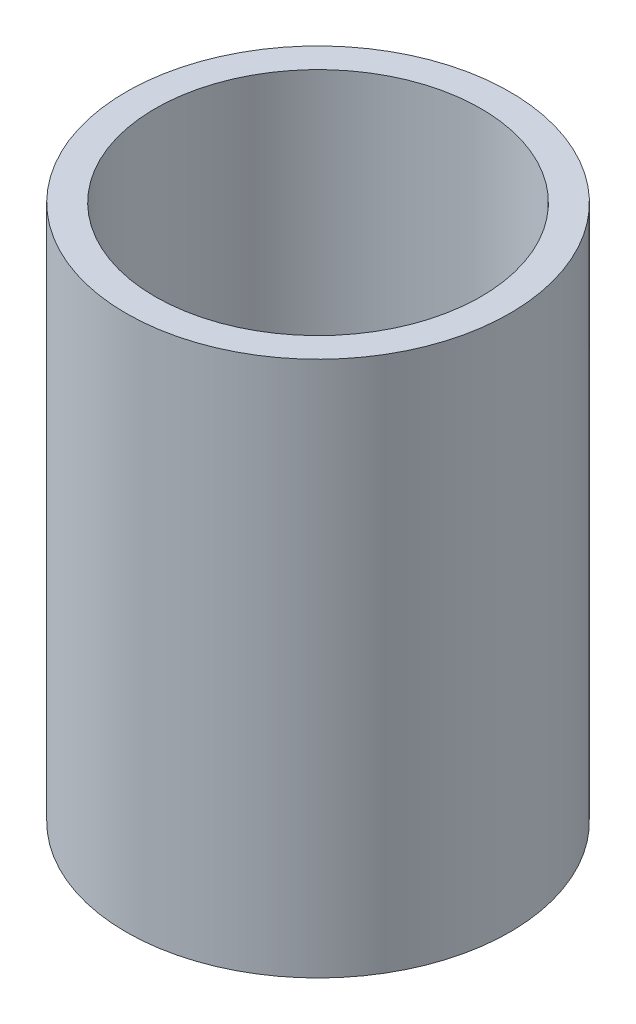
ISO-10303-21;
HEADER;
FILE_DESCRIPTION(('STEP AP214'),'2;1');
FILE_NAME('part.step','',(''),(''),'','','');
FILE_SCHEMA(('AUTOMOTIVE_DESIGN { 1 0 10303 214 1 1 1 1 }'));
ENDSEC;
DATA;
#1=APPLICATION_CONTEXT('core data for automotive mechanical design processes');
#2=APPLICATION_PROTOCOL_DEFINITION('international standard','automotive_design',2000,#1);
#3=PRODUCT_CONTEXT('',#1,'mechanical');
#4=PRODUCT('Part','Part','',(#3));
#5=PRODUCT_RELATED_PRODUCT_CATEGORY('part','',(#4));
#6=PRODUCT_DEFINITION_FORMATION('','',#4);
#7=PRODUCT_DEFINITION_CONTEXT('part definition',#1,'design');
#8=PRODUCT_DEFINITION('design','',#6,#7);
#9=PRODUCT_DEFINITION_SHAPE('','',#8);
#10=(LENGTH_UNIT() NAMED_UNIT(*) SI_UNIT(.MILLI.,.METRE.));
#11=(NAMED_UNIT(*) PLANE_ANGLE_UNIT() SI_UNIT($,.RADIAN.));
#12=(NAMED_UNIT(*) SI_UNIT($,.STERADIAN.) SOLID_ANGLE_UNIT());
#13=UNCERTAINTY_MEASURE_WITH_UNIT(LENGTH_MEASURE(1.E-05),#10,'distance_accuracy_value','');
#14=(GEOMETRIC_REPRESENTATION_CONTEXT(3) GLOBAL_UNCERTAINTY_ASSIGNED_CONTEXT((#13)) GLOBAL_UNIT_ASSIGNED_CONTEXT((#10,
#11,#12)) REPRESENTATION_CONTEXT('',''));
#15=CARTESIAN_POINT('',(0.,0.,0.));
#16=DIRECTION('',(0.,0.,1.));
#17=DIRECTION('',(1.,0.,0.));
#18=AXIS2_PLACEMENT_3D('',#15,#16,#17);
#19=CARTESIAN_POINT('',(0.,37.,0.));
#20=DIRECTION('',(0.,1.,0.));
#21=DIRECTION('',(0.,0.,1.));
#22=AXIS2_PLACEMENT_3D('',#19,#20,#21);
#23=PLANE('',#22);
#24=CARTESIAN_POINT('',(0.,37.,0.));
#25=DIRECTION('',(0.,1.,0.));
#26=DIRECTION('',(0.,0.,1.));
#27=AXIS2_PLACEMENT_3D('',#24,#25,#26);
#28=CIRCLE('',#27,13.25);
#29=CARTESIAN_POINT('',(0.,37.,13.25));
#30=VERTEX_POINT('',#29);
#31=EDGE_CURVE('E10',#30,#30,#28,.T.);
#32=ORIENTED_EDGE('',*,*,#31,.T.);
#33=EDGE_LOOP('',(#32));
#34=FACE_BOUND('',#33,.T.);
#35=CARTESIAN_POINT('',(0.,37.,0.));
#36=DIRECTION('',(0.,1.,0.));
#37=DIRECTION('',(0.,0.,1.));
#38=AXIS2_PLACEMENT_3D('',#35,#36,#37);
#39=CIRCLE('',#38,11.25);
#40=CARTESIAN_POINT('',(0.,37.,11.25));
#41=VERTEX_POINT('',#40);
#42=EDGE_CURVE('E42',#41,#41,#39,.T.);
#43=ORIENTED_EDGE('',*,*,#42,.F.);
#44=EDGE_LOOP('',(#43));
#45=FACE_BOUND('',#44,.T.);
#46=ADVANCED_FACE('F31',(#34,#45),#23,.T.);
#47=CARTESIAN_POINT('',(0.,0.,0.));
#48=DIRECTION('',(0.,1.,0.));
#49=DIRECTION('',(0.,0.,1.));
#50=AXIS2_PLACEMENT_3D('',#47,#48,#49);
#51=PLANE('',#50);
#52=CARTESIAN_POINT('',(0.,0.,0.));
#53=DIRECTION('',(0.,1.,0.));
#54=DIRECTION('',(0.,0.,1.));
#55=AXIS2_PLACEMENT_3D('',#52,#53,#54);
#56=CIRCLE('',#55,13.25);
#57=CARTESIAN_POINT('',(0.,0.,13.25));
#58=VERTEX_POINT('',#57);
#59=EDGE_CURVE('E35',#58,#58,#56,.T.);
#60=ORIENTED_EDGE('',*,*,#59,.F.);
#61=EDGE_LOOP('',(#60));
#62=FACE_BOUND('',#61,.T.);
#63=CARTESIAN_POINT('',(0.,0.,0.));
#64=DIRECTION('',(0.,1.,0.));
#65=DIRECTION('',(0.,0.,1.));
#66=AXIS2_PLACEMENT_3D('',#63,#64,#65);
#67=CIRCLE('',#66,11.25);
#68=CARTESIAN_POINT('',(0.,0.,11.25));
#69=VERTEX_POINT('',#68);
#70=EDGE_CURVE('E44',#69,#69,#67,.T.);
#71=ORIENTED_EDGE('',*,*,#70,.T.);
#72=EDGE_LOOP('',(#71));
#73=FACE_BOUND('',#72,.T.);
#74=ADVANCED_FACE('F54',(#62,#73),#51,.F.);
#75=CARTESIAN_POINT('',(0.,37.,0.));
#76=DIRECTION('',(0.,-1.,0.));
#77=DIRECTION('',(0.,0.,-1.));
#78=AXIS2_PLACEMENT_3D('',#75,#76,#77);
#79=CYLINDRICAL_SURFACE('',#78,13.25);
#80=ORIENTED_EDGE('',*,*,#31,.F.);
#81=EDGE_LOOP('',(#80));
#82=FACE_BOUND('',#81,.T.);
#83=ORIENTED_EDGE('',*,*,#59,.T.);
#84=EDGE_LOOP('',(#83));
#85=FACE_BOUND('',#84,.T.);
#86=ADVANCED_FACE('F33',(#82,#85),#79,.T.);
#87=CARTESIAN_POINT('',(0.,37.,0.));
#88=DIRECTION('',(0.,-1.,0.));
#89=DIRECTION('',(0.,0.,-1.));
#90=AXIS2_PLACEMENT_3D('',#87,#88,#89);
#91=CYLINDRICAL_SURFACE('',#90,11.25);
#92=ORIENTED_EDGE('',*,*,#42,.T.);
#93=EDGE_LOOP('',(#92));
#94=FACE_BOUND('',#93,.T.);
#95=ORIENTED_EDGE('',*,*,#70,.F.);
#96=EDGE_LOOP('',(#95));
#97=FACE_BOUND('',#96,.T.);
#98=ADVANCED_FACE('F50',(#94,#97),#91,.F.);
#99=CLOSED_SHELL('',(#46,#74,#86,#98));
#100=MANIFOLD_SOLID_BREP('B2',#99);
#101=ADVANCED_BREP_SHAPE_REPRESENTATION('',(#18,#100),#14);
#102=SHAPE_DEFINITION_REPRESENTATION(#9,#101);
ENDSEC;
END-ISO-10303-21;
